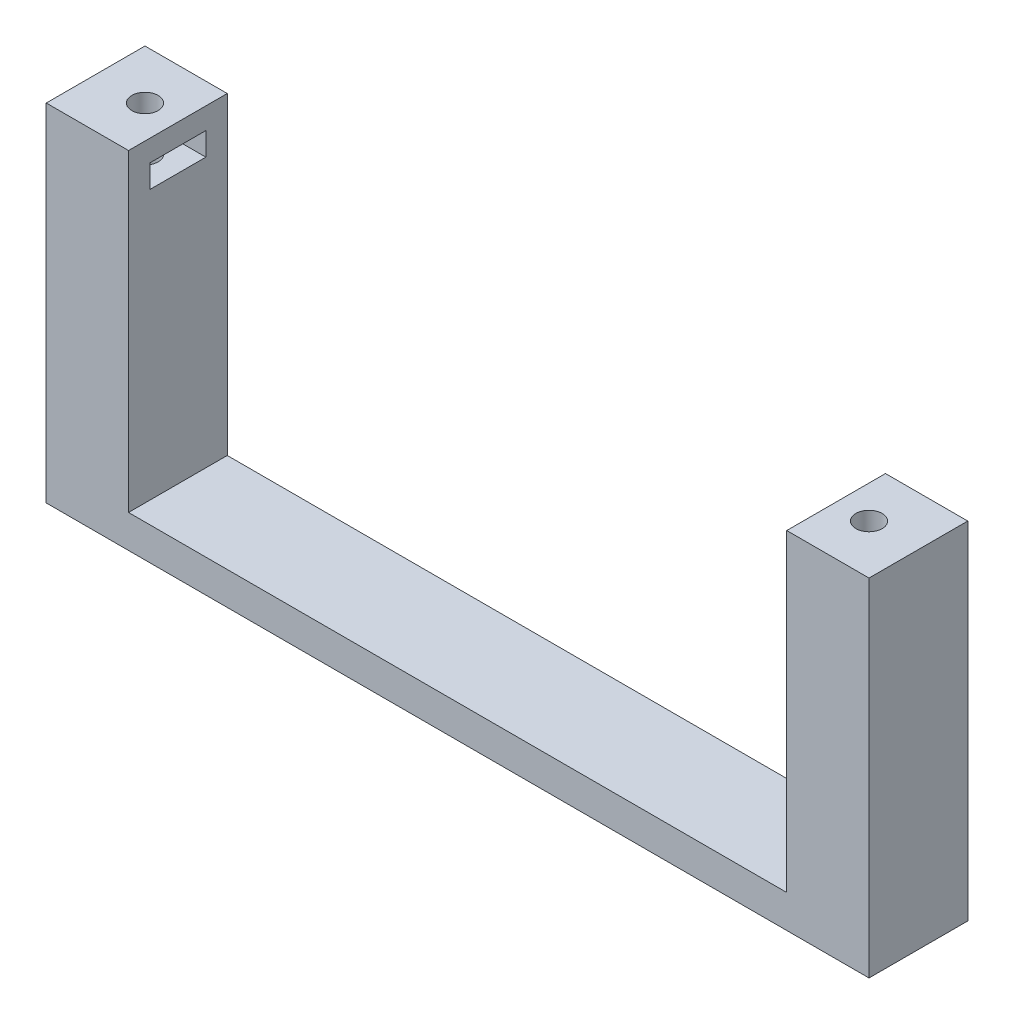
ISO-10303-21;
HEADER;
FILE_DESCRIPTION(('STEP AP214'),'2;1');
FILE_NAME('part.step','',(''),(''),'','','');
FILE_SCHEMA(('AUTOMOTIVE_DESIGN { 1 0 10303 214 1 1 1 1 }'));
ENDSEC;
DATA;
#1=APPLICATION_CONTEXT('core data for automotive mechanical design processes');
#2=APPLICATION_PROTOCOL_DEFINITION('international standard','automotive_design',2000,#1);
#3=PRODUCT_CONTEXT('',#1,'mechanical');
#4=PRODUCT('Part','Part','',(#3));
#5=PRODUCT_RELATED_PRODUCT_CATEGORY('part','',(#4));
#6=PRODUCT_DEFINITION_FORMATION('','',#4);
#7=PRODUCT_DEFINITION_CONTEXT('part definition',#1,'design');
#8=PRODUCT_DEFINITION('design','',#6,#7);
#9=PRODUCT_DEFINITION_SHAPE('','',#8);
#10=(LENGTH_UNIT() NAMED_UNIT(*) SI_UNIT(.MILLI.,.METRE.));
#11=(NAMED_UNIT(*) PLANE_ANGLE_UNIT() SI_UNIT($,.RADIAN.));
#12=(NAMED_UNIT(*) SI_UNIT($,.STERADIAN.) SOLID_ANGLE_UNIT());
#13=UNCERTAINTY_MEASURE_WITH_UNIT(LENGTH_MEASURE(1.E-05),#10,'distance_accuracy_value','');
#14=(GEOMETRIC_REPRESENTATION_CONTEXT(3) GLOBAL_UNCERTAINTY_ASSIGNED_CONTEXT((#13)) GLOBAL_UNIT_ASSIGNED_CONTEXT((#10,
#11,#12)) REPRESENTATION_CONTEXT('',''));
#15=CARTESIAN_POINT('',(0.,0.,0.));
#16=DIRECTION('',(0.,0.,1.));
#17=DIRECTION('',(1.,0.,0.));
#18=AXIS2_PLACEMENT_3D('',#15,#16,#17);
#19=CARTESIAN_POINT('',(-44.,4.,0.));
#20=DIRECTION('',(0.,-1.,0.));
#21=DIRECTION('',(0.,0.,-1.));
#22=AXIS2_PLACEMENT_3D('',#19,#20,#21);
#23=CYLINDRICAL_SURFACE('',#22,1.6);
#24=CARTESIAN_POINT('',(-44.,42.1,0.));
#25=DIRECTION('',(0.,1.,0.));
#26=DIRECTION('',(0.,0.,1.));
#27=AXIS2_PLACEMENT_3D('',#24,#25,#26);
#28=CIRCLE('',#27,1.6);
#29=CARTESIAN_POINT('',(-44.,42.1,1.6));
#30=VERTEX_POINT('',#29);
#31=EDGE_CURVE('E316',#30,#30,#28,.T.);
#32=ORIENTED_EDGE('',*,*,#31,.T.);
#33=EDGE_LOOP('',(#32));
#34=FACE_BOUND('',#33,.T.);
#35=CARTESIAN_POINT('',(-44.,39.5,0.));
#36=DIRECTION('',(0.,-1.,0.));
#37=DIRECTION('',(0.,0.,-1.));
#38=AXIS2_PLACEMENT_3D('',#35,#36,#37);
#39=CIRCLE('',#38,1.6);
#40=CARTESIAN_POINT('',(-44.,39.5,-1.6));
#41=VERTEX_POINT('',#40);
#42=EDGE_CURVE('E227',#41,#41,#39,.T.);
#43=ORIENTED_EDGE('',*,*,#42,.T.);
#44=EDGE_LOOP('',(#43));
#45=FACE_BOUND('',#44,.T.);
#46=ADVANCED_FACE('F68',(#34,#45),#23,.F.);
#47=CARTESIAN_POINT('',(-40.,42.1,-6.));
#48=DIRECTION('',(-1.,0.,0.));
#49=DIRECTION('',(0.,0.,1.));
#50=AXIS2_PLACEMENT_3D('',#47,#48,#49);
#51=PLANE('',#50);
#52=DIRECTION('',(0.,0.,-1.));
#53=VECTOR('',#52,1.);
#54=CARTESIAN_POINT('',(-40.,4.,-6.));
#55=LINE('',#54,#53);
#56=CARTESIAN_POINT('',(-40.,4.,6.));
#57=VERTEX_POINT('',#56);
#58=CARTESIAN_POINT('',(-40.,4.,-6.));
#59=VERTEX_POINT('',#58);
#60=EDGE_CURVE('E320',#57,#59,#55,.T.);
#61=ORIENTED_EDGE('',*,*,#60,.T.);
#62=DIRECTION('',(0.,-1.,0.));
#63=VECTOR('',#62,1.);
#64=CARTESIAN_POINT('',(-40.,42.1,-6.));
#65=LINE('',#64,#63);
#66=CARTESIAN_POINT('',(-40.,42.1,-6.));
#67=VERTEX_POINT('',#66);
#68=EDGE_CURVE('E335',#67,#59,#65,.T.);
#69=ORIENTED_EDGE('',*,*,#68,.F.);
#70=DIRECTION('',(0.,0.,-1.));
#71=VECTOR('',#70,1.);
#72=CARTESIAN_POINT('',(-40.,42.1,-6.));
#73=LINE('',#72,#71);
#74=CARTESIAN_POINT('',(-40.,42.1,6.));
#75=VERTEX_POINT('',#74);
#76=EDGE_CURVE('E328',#75,#67,#73,.T.);
#77=ORIENTED_EDGE('',*,*,#76,.F.);
#78=DIRECTION('',(0.,-1.,0.));
#79=VECTOR('',#78,1.);
#80=CARTESIAN_POINT('',(-40.,42.1,6.));
#81=LINE('',#80,#79);
#82=EDGE_CURVE('E342',#75,#57,#81,.T.);
#83=ORIENTED_EDGE('',*,*,#82,.T.);
#84=EDGE_LOOP('',(#61,#69,#77,#83));
#85=FACE_BOUND('',#84,.T.);
#86=DIRECTION('',(0.,-1.,0.));
#87=VECTOR('',#86,1.);
#88=CARTESIAN_POINT('',(-40.,0.,-3.40000000000002));
#89=LINE('',#88,#87);
#90=CARTESIAN_POINT('',(-40.,39.5,-3.40000000000003));
#91=VERTEX_POINT('',#90);
#92=CARTESIAN_POINT('',(-40.,36.7,-3.40000000000002));
#93=VERTEX_POINT('',#92);
#94=EDGE_CURVE('E84',#91,#93,#89,.T.);
#95=ORIENTED_EDGE('',*,*,#94,.T.);
#96=DIRECTION('',(0.,0.,-1.));
#97=VECTOR('',#96,1.);
#98=CARTESIAN_POINT('',(-40.,36.7,0.));
#99=LINE('',#98,#97);
#100=CARTESIAN_POINT('',(-40.,36.7,3.39999999999998));
#101=VERTEX_POINT('',#100);
#102=EDGE_CURVE('E205',#101,#93,#99,.T.);
#103=ORIENTED_EDGE('',*,*,#102,.F.);
#104=DIRECTION('',(0.,-1.,0.));
#105=VECTOR('',#104,1.);
#106=CARTESIAN_POINT('',(-40.,0.,3.39999999999997));
#107=LINE('',#106,#105);
#108=CARTESIAN_POINT('',(-40.,39.5,3.39999999999998));
#109=VERTEX_POINT('',#108);
#110=EDGE_CURVE('E209',#109,#101,#107,.T.);
#111=ORIENTED_EDGE('',*,*,#110,.F.);
#112=DIRECTION('',(0.,0.,-1.));
#113=VECTOR('',#112,1.);
#114=CARTESIAN_POINT('',(-40.,39.5,0.));
#115=LINE('',#114,#113);
#116=EDGE_CURVE('E218',#109,#91,#115,.T.);
#117=ORIENTED_EDGE('',*,*,#116,.T.);
#118=EDGE_LOOP('',(#95,#103,#111,#117));
#119=FACE_BOUND('',#118,.T.);
#120=ADVANCED_FACE('F412',(#85,#119),#51,.F.);
#121=CARTESIAN_POINT('',(44.,4.,0.));
#122=DIRECTION('',(0.,-1.,0.));
#123=DIRECTION('',(0.,0.,-1.));
#124=AXIS2_PLACEMENT_3D('',#121,#122,#123);
#125=CYLINDRICAL_SURFACE('',#124,1.6);
#126=CARTESIAN_POINT('',(44.,42.1,0.));
#127=DIRECTION('',(0.,1.,0.));
#128=DIRECTION('',(0.,0.,1.));
#129=AXIS2_PLACEMENT_3D('',#126,#127,#128);
#130=CIRCLE('',#129,1.6);
#131=CARTESIAN_POINT('',(44.,42.1,1.59999999999997));
#132=VERTEX_POINT('',#131);
#133=EDGE_CURVE('E288',#132,#132,#130,.T.);
#134=ORIENTED_EDGE('',*,*,#133,.T.);
#135=EDGE_LOOP('',(#134));
#136=FACE_BOUND('',#135,.T.);
#137=CARTESIAN_POINT('',(44.,39.5,0.));
#138=DIRECTION('',(0.,-1.,0.));
#139=DIRECTION('',(0.,0.,-1.));
#140=AXIS2_PLACEMENT_3D('',#137,#138,#139);
#141=CIRCLE('',#140,1.6);
#142=CARTESIAN_POINT('',(44.,39.5,-1.60000000000002));
#143=VERTEX_POINT('',#142);
#144=EDGE_CURVE('E272',#143,#143,#141,.T.);
#145=ORIENTED_EDGE('',*,*,#144,.T.);
#146=EDGE_LOOP('',(#145));
#147=FACE_BOUND('',#146,.T.);
#148=ADVANCED_FACE('F431',(#136,#147),#125,.F.);
#149=CARTESIAN_POINT('',(40.,42.1,-6.));
#150=DIRECTION('',(1.,0.,0.));
#151=DIRECTION('',(0.,0.,-1.));
#152=AXIS2_PLACEMENT_3D('',#149,#150,#151);
#153=PLANE('',#152);
#154=DIRECTION('',(0.,0.,1.));
#155=VECTOR('',#154,1.);
#156=CARTESIAN_POINT('',(40.,4.,-6.));
#157=LINE('',#156,#155);
#158=CARTESIAN_POINT('',(40.,4.,-6.));
#159=VERTEX_POINT('',#158);
#160=CARTESIAN_POINT('',(40.,4.,6.));
#161=VERTEX_POINT('',#160);
#162=EDGE_CURVE('E292',#159,#161,#157,.T.);
#163=ORIENTED_EDGE('',*,*,#162,.T.);
#164=DIRECTION('',(0.,-1.,0.));
#165=VECTOR('',#164,1.);
#166=CARTESIAN_POINT('',(40.,42.1,6.));
#167=LINE('',#166,#165);
#168=CARTESIAN_POINT('',(40.,42.1,6.));
#169=VERTEX_POINT('',#168);
#170=EDGE_CURVE('E307',#169,#161,#167,.T.);
#171=ORIENTED_EDGE('',*,*,#170,.F.);
#172=DIRECTION('',(0.,0.,1.));
#173=VECTOR('',#172,1.);
#174=CARTESIAN_POINT('',(40.,42.1,-6.));
#175=LINE('',#174,#173);
#176=CARTESIAN_POINT('',(40.,42.1,-6.));
#177=VERTEX_POINT('',#176);
#178=EDGE_CURVE('E300',#177,#169,#175,.T.);
#179=ORIENTED_EDGE('',*,*,#178,.F.);
#180=DIRECTION('',(0.,-1.,0.));
#181=VECTOR('',#180,1.);
#182=CARTESIAN_POINT('',(40.,42.1,-6.));
#183=LINE('',#182,#181);
#184=EDGE_CURVE('E313',#177,#159,#183,.T.);
#185=ORIENTED_EDGE('',*,*,#184,.T.);
#186=EDGE_LOOP('',(#163,#171,#179,#185));
#187=FACE_BOUND('',#186,.T.);
#188=DIRECTION('',(0.,-1.,0.));
#189=VECTOR('',#188,1.);
#190=CARTESIAN_POINT('',(40.,0.,3.40000000000002));
#191=LINE('',#190,#189);
#192=CARTESIAN_POINT('',(40.,39.5,3.40000000000003));
#193=VERTEX_POINT('',#192);
#194=CARTESIAN_POINT('',(40.,36.7,3.40000000000002));
#195=VERTEX_POINT('',#194);
#196=EDGE_CURVE('E92',#193,#195,#191,.T.);
#197=ORIENTED_EDGE('',*,*,#196,.T.);
#198=DIRECTION('',(0.,0.,1.));
#199=VECTOR('',#198,1.);
#200=CARTESIAN_POINT('',(40.,36.7,0.));
#201=LINE('',#200,#199);
#202=CARTESIAN_POINT('',(40.,36.7,-3.39999999999998));
#203=VERTEX_POINT('',#202);
#204=EDGE_CURVE('E244',#203,#195,#201,.T.);
#205=ORIENTED_EDGE('',*,*,#204,.F.);
#206=DIRECTION('',(0.,-1.,0.));
#207=VECTOR('',#206,1.);
#208=CARTESIAN_POINT('',(40.,0.,-3.39999999999997));
#209=LINE('',#208,#207);
#210=CARTESIAN_POINT('',(40.,39.5,-3.39999999999998));
#211=VERTEX_POINT('',#210);
#212=EDGE_CURVE('E262',#211,#203,#209,.T.);
#213=ORIENTED_EDGE('',*,*,#212,.F.);
#214=DIRECTION('',(0.,0.,1.));
#215=VECTOR('',#214,1.);
#216=CARTESIAN_POINT('',(40.,39.5,0.));
#217=LINE('',#216,#215);
#218=EDGE_CURVE('E258',#211,#193,#217,.T.);
#219=ORIENTED_EDGE('',*,*,#218,.T.);
#220=EDGE_LOOP('',(#197,#205,#213,#219));
#221=FACE_BOUND('',#220,.T.);
#222=ADVANCED_FACE('F421',(#187,#221),#153,.F.);
#223=CARTESIAN_POINT('',(0.,4.,0.));
#224=DIRECTION('',(0.,-1.,0.));
#225=DIRECTION('',(0.,0.,-1.));
#226=AXIS2_PLACEMENT_3D('',#223,#224,#225);
#227=PLANE('',#226);
#228=ORIENTED_EDGE('',*,*,#162,.F.);
#229=DIRECTION('',(1.,0.,0.));
#230=VECTOR('',#229,1.);
#231=CARTESIAN_POINT('',(-50.,4.,-6.));
#232=LINE('',#231,#230);
#233=EDGE_CURVE('E359',#59,#159,#232,.T.);
#234=ORIENTED_EDGE('',*,*,#233,.F.);
#235=ORIENTED_EDGE('',*,*,#60,.F.);
#236=DIRECTION('',(1.,0.,0.));
#237=VECTOR('',#236,1.);
#238=CARTESIAN_POINT('',(-50.,4.,6.));
#239=LINE('',#238,#237);
#240=EDGE_CURVE('E355',#57,#161,#239,.T.);
#241=ORIENTED_EDGE('',*,*,#240,.T.);
#242=EDGE_LOOP('',(#228,#234,#235,#241));
#243=FACE_BOUND('',#242,.T.);
#244=ADVANCED_FACE('F416',(#243),#227,.F.);
#245=CARTESIAN_POINT('',(0.,0.,0.));
#246=DIRECTION('',(0.,-1.,0.));
#247=DIRECTION('',(0.,0.,-1.));
#248=AXIS2_PLACEMENT_3D('',#245,#246,#247);
#249=PLANE('',#248);
#250=CARTESIAN_POINT('',(-44.,0.,0.));
#251=DIRECTION('',(0.,1.,0.));
#252=DIRECTION('',(0.,0.,1.));
#253=AXIS2_PLACEMENT_3D('',#250,#251,#252);
#254=CIRCLE('',#253,1.6);
#255=CARTESIAN_POINT('',(-44.,0.,1.6));
#256=VERTEX_POINT('',#255);
#257=EDGE_CURVE('E350',#256,#256,#254,.T.);
#258=ORIENTED_EDGE('',*,*,#257,.T.);
#259=EDGE_LOOP('',(#258));
#260=FACE_BOUND('',#259,.T.);
#261=DIRECTION('',(1.,0.,0.));
#262=VECTOR('',#261,1.);
#263=CARTESIAN_POINT('',(-50.,0.,6.));
#264=LINE('',#263,#262);
#265=CARTESIAN_POINT('',(-50.,0.,6.));
#266=VERTEX_POINT('',#265);
#267=CARTESIAN_POINT('',(50.,0.,6.));
#268=VERTEX_POINT('',#267);
#269=EDGE_CURVE('E354',#266,#268,#264,.T.);
#270=ORIENTED_EDGE('',*,*,#269,.F.);
#271=DIRECTION('',(0.,0.,1.));
#272=VECTOR('',#271,1.);
#273=CARTESIAN_POINT('',(-50.,0.,-6.));
#274=LINE('',#273,#272);
#275=CARTESIAN_POINT('',(-50.,0.,-6.));
#276=VERTEX_POINT('',#275);
#277=EDGE_CURVE('E360',#276,#266,#274,.T.);
#278=ORIENTED_EDGE('',*,*,#277,.F.);
#279=DIRECTION('',(1.,0.,0.));
#280=VECTOR('',#279,1.);
#281=CARTESIAN_POINT('',(-50.,0.,-6.));
#282=LINE('',#281,#280);
#283=CARTESIAN_POINT('',(50.,0.,-6.));
#284=VERTEX_POINT('',#283);
#285=EDGE_CURVE('E372',#276,#284,#282,.T.);
#286=ORIENTED_EDGE('',*,*,#285,.T.);
#287=DIRECTION('',(0.,0.,1.));
#288=VECTOR('',#287,1.);
#289=CARTESIAN_POINT('',(50.,0.,-6.));
#290=LINE('',#289,#288);
#291=EDGE_CURVE('E368',#284,#268,#290,.T.);
#292=ORIENTED_EDGE('',*,*,#291,.T.);
#293=EDGE_LOOP('',(#270,#278,#286,#292));
#294=FACE_BOUND('',#293,.T.);
#295=CARTESIAN_POINT('',(44.,0.,0.));
#296=DIRECTION('',(0.,1.,0.));
#297=DIRECTION('',(0.,0.,1.));
#298=AXIS2_PLACEMENT_3D('',#295,#296,#297);
#299=CIRCLE('',#298,1.6);
#300=CARTESIAN_POINT('',(44.,0.,1.59999999999997));
#301=VERTEX_POINT('',#300);
#302=EDGE_CURVE('E346',#301,#301,#299,.T.);
#303=ORIENTED_EDGE('',*,*,#302,.T.);
#304=EDGE_LOOP('',(#303));
#305=FACE_BOUND('',#304,.T.);
#306=ADVANCED_FACE('F396',(#260,#294,#305),#249,.T.);
#307=CARTESIAN_POINT('',(-50.,4.,6.));
#308=DIRECTION('',(0.,0.,-1.));
#309=DIRECTION('',(-1.,0.,0.));
#310=AXIS2_PLACEMENT_3D('',#307,#308,#309);
#311=PLANE('',#310);
#312=ORIENTED_EDGE('',*,*,#269,.T.);
#313=DIRECTION('',(0.,-1.,0.));
#314=VECTOR('',#313,1.);
#315=CARTESIAN_POINT('',(50.,4.,6.));
#316=LINE('',#315,#314);
#317=CARTESIAN_POINT('',(50.,42.1,6.));
#318=VERTEX_POINT('',#317);
#319=EDGE_CURVE('E12',#318,#268,#316,.T.);
#320=ORIENTED_EDGE('',*,*,#319,.F.);
#321=DIRECTION('',(1.,0.,0.));
#322=VECTOR('',#321,1.);
#323=CARTESIAN_POINT('',(50.,42.1,6.));
#324=LINE('',#323,#322);
#325=EDGE_CURVE('E303',#169,#318,#324,.T.);
#326=ORIENTED_EDGE('',*,*,#325,.F.);
#327=ORIENTED_EDGE('',*,*,#170,.T.);
#328=ORIENTED_EDGE('',*,*,#240,.F.);
#329=ORIENTED_EDGE('',*,*,#82,.F.);
#330=DIRECTION('',(1.,0.,0.));
#331=VECTOR('',#330,1.);
#332=CARTESIAN_POINT('',(-50.,42.1,6.));
#333=LINE('',#332,#331);
#334=CARTESIAN_POINT('',(-50.,42.1,6.));
#335=VERTEX_POINT('',#334);
#336=EDGE_CURVE('E325',#335,#75,#333,.T.);
#337=ORIENTED_EDGE('',*,*,#336,.F.);
#338=DIRECTION('',(0.,-1.,0.));
#339=VECTOR('',#338,1.);
#340=CARTESIAN_POINT('',(-50.,4.,6.));
#341=LINE('',#340,#339);
#342=EDGE_CURVE('E364',#335,#266,#341,.T.);
#343=ORIENTED_EDGE('',*,*,#342,.T.);
#344=EDGE_LOOP('',(#312,#320,#326,#327,#328,#329,#337,#343));
#345=FACE_BOUND('',#344,.T.);
#346=ADVANCED_FACE('F70',(#345),#311,.F.);
#347=CARTESIAN_POINT('',(50.,4.,-6.));
#348=DIRECTION('',(1.,0.,0.));
#349=DIRECTION('',(0.,0.,-1.));
#350=AXIS2_PLACEMENT_3D('',#347,#348,#349);
#351=PLANE('',#350);
#352=ORIENTED_EDGE('',*,*,#291,.F.);
#353=DIRECTION('',(0.,-1.,0.));
#354=VECTOR('',#353,1.);
#355=CARTESIAN_POINT('',(50.,4.,-6.));
#356=LINE('',#355,#354);
#357=CARTESIAN_POINT('',(50.,42.1,-6.));
#358=VERTEX_POINT('',#357);
#359=EDGE_CURVE('E77',#358,#284,#356,.T.);
#360=ORIENTED_EDGE('',*,*,#359,.F.);
#361=DIRECTION('',(0.,0.,-1.));
#362=VECTOR('',#361,1.);
#363=CARTESIAN_POINT('',(50.,42.1,-6.));
#364=LINE('',#363,#362);
#365=EDGE_CURVE('E293',#318,#358,#364,.T.);
#366=ORIENTED_EDGE('',*,*,#365,.F.);
#367=ORIENTED_EDGE('',*,*,#319,.T.);
#368=EDGE_LOOP('',(#352,#360,#366,#367));
#369=FACE_BOUND('',#368,.T.);
#370=ADVANCED_FACE('F392',(#369),#351,.T.);
#371=CARTESIAN_POINT('',(-50.,4.,-6.));
#372=DIRECTION('',(0.,0.,-1.));
#373=DIRECTION('',(-1.,0.,0.));
#374=AXIS2_PLACEMENT_3D('',#371,#372,#373);
#375=PLANE('',#374);
#376=ORIENTED_EDGE('',*,*,#285,.F.);
#377=DIRECTION('',(0.,-1.,0.));
#378=VECTOR('',#377,1.);
#379=CARTESIAN_POINT('',(-50.,4.,-6.));
#380=LINE('',#379,#378);
#381=CARTESIAN_POINT('',(-50.,42.1,-6.));
#382=VERTEX_POINT('',#381);
#383=EDGE_CURVE('E381',#382,#276,#380,.T.);
#384=ORIENTED_EDGE('',*,*,#383,.F.);
#385=DIRECTION('',(-1.,0.,0.));
#386=VECTOR('',#385,1.);
#387=CARTESIAN_POINT('',(-50.,42.1,-6.));
#388=LINE('',#387,#386);
#389=EDGE_CURVE('E331',#67,#382,#388,.T.);
#390=ORIENTED_EDGE('',*,*,#389,.F.);
#391=ORIENTED_EDGE('',*,*,#68,.T.);
#392=ORIENTED_EDGE('',*,*,#233,.T.);
#393=ORIENTED_EDGE('',*,*,#184,.F.);
#394=DIRECTION('',(-1.,0.,0.));
#395=VECTOR('',#394,1.);
#396=CARTESIAN_POINT('',(50.,42.1,-6.));
#397=LINE('',#396,#395);
#398=EDGE_CURVE('E297',#358,#177,#397,.T.);
#399=ORIENTED_EDGE('',*,*,#398,.F.);
#400=ORIENTED_EDGE('',*,*,#359,.T.);
#401=EDGE_LOOP('',(#376,#384,#390,#391,#392,#393,#399,#400));
#402=FACE_BOUND('',#401,.T.);
#403=ADVANCED_FACE('F388',(#402),#375,.T.);
#404=CARTESIAN_POINT('',(-50.,4.,-6.));
#405=DIRECTION('',(1.,0.,0.));
#406=DIRECTION('',(0.,0.,-1.));
#407=AXIS2_PLACEMENT_3D('',#404,#405,#406);
#408=PLANE('',#407);
#409=ORIENTED_EDGE('',*,*,#277,.T.);
#410=ORIENTED_EDGE('',*,*,#342,.F.);
#411=DIRECTION('',(0.,0.,1.));
#412=VECTOR('',#411,1.);
#413=CARTESIAN_POINT('',(-50.,42.1,-6.));
#414=LINE('',#413,#412);
#415=EDGE_CURVE('E321',#382,#335,#414,.T.);
#416=ORIENTED_EDGE('',*,*,#415,.F.);
#417=ORIENTED_EDGE('',*,*,#383,.T.);
#418=EDGE_LOOP('',(#409,#410,#416,#417));
#419=FACE_BOUND('',#418,.T.);
#420=ADVANCED_FACE('F399',(#419),#408,.F.);
#421=CARTESIAN_POINT('',(-44.,36.7,0.));
#422=DIRECTION('',(0.,-1.,0.));
#423=DIRECTION('',(0.,0.,-1.));
#424=AXIS2_PLACEMENT_3D('',#421,#422,#423);
#425=CIRCLE('',#424,1.6);
#426=CARTESIAN_POINT('',(-44.,36.7,-1.6));
#427=VERTEX_POINT('',#426);
#428=EDGE_CURVE('E236',#427,#427,#425,.T.);
#429=ORIENTED_EDGE('',*,*,#428,.F.);
#430=EDGE_LOOP('',(#429));
#431=FACE_BOUND('',#430,.T.);
#432=ORIENTED_EDGE('',*,*,#257,.F.);
#433=EDGE_LOOP('',(#432));
#434=FACE_BOUND('',#433,.T.);
#435=ADVANCED_FACE('F467',(#431,#434),#23,.F.);
#436=CARTESIAN_POINT('',(44.,36.7,0.));
#437=DIRECTION('',(0.,-1.,0.));
#438=DIRECTION('',(0.,0.,-1.));
#439=AXIS2_PLACEMENT_3D('',#436,#437,#438);
#440=CIRCLE('',#439,1.6);
#441=CARTESIAN_POINT('',(44.,36.7,-1.60000000000002));
#442=VERTEX_POINT('',#441);
#443=EDGE_CURVE('E284',#442,#442,#440,.T.);
#444=ORIENTED_EDGE('',*,*,#443,.F.);
#445=EDGE_LOOP('',(#444));
#446=FACE_BOUND('',#445,.T.);
#447=ORIENTED_EDGE('',*,*,#302,.F.);
#448=EDGE_LOOP('',(#447));
#449=FACE_BOUND('',#448,.T.);
#450=ADVANCED_FACE('F435',(#446,#449),#125,.F.);
#451=CARTESIAN_POINT('',(0.,42.1,0.));
#452=DIRECTION('',(0.,1.,0.));
#453=DIRECTION('',(0.,0.,1.));
#454=AXIS2_PLACEMENT_3D('',#451,#452,#453);
#455=PLANE('',#454);
#456=ORIENTED_EDGE('',*,*,#415,.T.);
#457=ORIENTED_EDGE('',*,*,#336,.T.);
#458=ORIENTED_EDGE('',*,*,#76,.T.);
#459=ORIENTED_EDGE('',*,*,#389,.T.);
#460=EDGE_LOOP('',(#456,#457,#458,#459));
#461=FACE_BOUND('',#460,.T.);
#462=ORIENTED_EDGE('',*,*,#31,.F.);
#463=EDGE_LOOP('',(#462));
#464=FACE_BOUND('',#463,.T.);
#465=ADVANCED_FACE('F407',(#461,#464),#455,.T.);
#466=CARTESIAN_POINT('',(0.,42.1,0.));
#467=DIRECTION('',(0.,-1.,0.));
#468=DIRECTION('',(0.,0.,-1.));
#469=AXIS2_PLACEMENT_3D('',#466,#467,#468);
#470=PLANE('',#469);
#471=ORIENTED_EDGE('',*,*,#365,.T.);
#472=ORIENTED_EDGE('',*,*,#398,.T.);
#473=ORIENTED_EDGE('',*,*,#178,.T.);
#474=ORIENTED_EDGE('',*,*,#325,.T.);
#475=EDGE_LOOP('',(#471,#472,#473,#474));
#476=FACE_BOUND('',#475,.T.);
#477=ORIENTED_EDGE('',*,*,#133,.F.);
#478=EDGE_LOOP('',(#477));
#479=FACE_BOUND('',#478,.T.);
#480=ADVANCED_FACE('F424',(#476,#479),#470,.F.);
#481=CARTESIAN_POINT('',(48.5,0.,3.40000000000003));
#482=DIRECTION('',(0.,0.,-1.));
#483=DIRECTION('',(-1.,0.,0.));
#484=AXIS2_PLACEMENT_3D('',#481,#482,#483);
#485=PLANE('',#484);
#486=ORIENTED_EDGE('',*,*,#196,.F.);
#487=DIRECTION('',(-1.,0.,0.));
#488=VECTOR('',#487,1.);
#489=CARTESIAN_POINT('',(48.5,39.5,3.40000000000003));
#490=LINE('',#489,#488);
#491=CARTESIAN_POINT('',(48.5,39.5,3.40000000000003));
#492=VERTEX_POINT('',#491);
#493=EDGE_CURVE('E255',#492,#193,#490,.T.);
#494=ORIENTED_EDGE('',*,*,#493,.F.);
#495=DIRECTION('',(0.,-1.,0.));
#496=VECTOR('',#495,1.);
#497=CARTESIAN_POINT('',(48.5,0.,3.40000000000003));
#498=LINE('',#497,#496);
#499=CARTESIAN_POINT('',(48.5,36.7,3.40000000000003));
#500=VERTEX_POINT('',#499);
#501=EDGE_CURVE('E240',#492,#500,#498,.T.);
#502=ORIENTED_EDGE('',*,*,#501,.T.);
#503=DIRECTION('',(-1.,0.,0.));
#504=VECTOR('',#503,1.);
#505=CARTESIAN_POINT('',(48.5,36.7,3.40000000000003));
#506=LINE('',#505,#504);
#507=EDGE_CURVE('E269',#500,#195,#506,.T.);
#508=ORIENTED_EDGE('',*,*,#507,.T.);
#509=EDGE_LOOP('',(#486,#494,#502,#508));
#510=FACE_BOUND('',#509,.T.);
#511=ADVANCED_FACE('F427',(#510),#485,.T.);
#512=CARTESIAN_POINT('',(48.5,36.7,0.));
#513=DIRECTION('',(0.,-1.,0.));
#514=DIRECTION('',(0.,0.,-1.));
#515=AXIS2_PLACEMENT_3D('',#512,#513,#514);
#516=PLANE('',#515);
#517=ORIENTED_EDGE('',*,*,#443,.T.);
#518=EDGE_LOOP('',(#517));
#519=FACE_BOUND('',#518,.T.);
#520=ORIENTED_EDGE('',*,*,#204,.T.);
#521=ORIENTED_EDGE('',*,*,#507,.F.);
#522=DIRECTION('',(0.,0.,1.));
#523=VECTOR('',#522,1.);
#524=CARTESIAN_POINT('',(48.5,36.7,0.));
#525=LINE('',#524,#523);
#526=CARTESIAN_POINT('',(48.5,36.7,-3.39999999999997));
#527=VERTEX_POINT('',#526);
#528=EDGE_CURVE('E251',#527,#500,#525,.T.);
#529=ORIENTED_EDGE('',*,*,#528,.F.);
#530=DIRECTION('',(-1.,0.,0.));
#531=VECTOR('',#530,1.);
#532=CARTESIAN_POINT('',(48.5,36.7,-3.39999999999997));
#533=LINE('',#532,#531);
#534=EDGE_CURVE('E273',#527,#203,#533,.T.);
#535=ORIENTED_EDGE('',*,*,#534,.T.);
#536=EDGE_LOOP('',(#520,#521,#529,#535));
#537=FACE_BOUND('',#536,.T.);
#538=ADVANCED_FACE('F455',(#519,#537),#516,.F.);
#539=CARTESIAN_POINT('',(48.5,0.,-3.39999999999997));
#540=DIRECTION('',(0.,0.,-1.));
#541=DIRECTION('',(-1.,0.,0.));
#542=AXIS2_PLACEMENT_3D('',#539,#540,#541);
#543=PLANE('',#542);
#544=ORIENTED_EDGE('',*,*,#212,.T.);
#545=ORIENTED_EDGE('',*,*,#534,.F.);
#546=DIRECTION('',(0.,-1.,0.));
#547=VECTOR('',#546,1.);
#548=CARTESIAN_POINT('',(48.5,0.,-3.39999999999997));
#549=LINE('',#548,#547);
#550=CARTESIAN_POINT('',(48.5,39.5,-3.39999999999997));
#551=VERTEX_POINT('',#550);
#552=EDGE_CURVE('E247',#551,#527,#549,.T.);
#553=ORIENTED_EDGE('',*,*,#552,.F.);
#554=DIRECTION('',(-1.,0.,0.));
#555=VECTOR('',#554,1.);
#556=CARTESIAN_POINT('',(48.5,39.5,-3.39999999999997));
#557=LINE('',#556,#555);
#558=EDGE_CURVE('E276',#551,#211,#557,.T.);
#559=ORIENTED_EDGE('',*,*,#558,.T.);
#560=EDGE_LOOP('',(#544,#545,#553,#559));
#561=FACE_BOUND('',#560,.T.);
#562=ADVANCED_FACE('F442',(#561),#543,.F.);
#563=CARTESIAN_POINT('',(48.5,39.5,0.));
#564=DIRECTION('',(0.,-1.,0.));
#565=DIRECTION('',(0.,0.,-1.));
#566=AXIS2_PLACEMENT_3D('',#563,#564,#565);
#567=PLANE('',#566);
#568=ORIENTED_EDGE('',*,*,#144,.F.);
#569=EDGE_LOOP('',(#568));
#570=FACE_BOUND('',#569,.T.);
#571=ORIENTED_EDGE('',*,*,#218,.F.);
#572=ORIENTED_EDGE('',*,*,#558,.F.);
#573=DIRECTION('',(0.,0.,1.));
#574=VECTOR('',#573,1.);
#575=CARTESIAN_POINT('',(48.5,39.5,0.));
#576=LINE('',#575,#574);
#577=EDGE_CURVE('E243',#551,#492,#576,.T.);
#578=ORIENTED_EDGE('',*,*,#577,.T.);
#579=ORIENTED_EDGE('',*,*,#493,.T.);
#580=EDGE_LOOP('',(#571,#572,#578,#579));
#581=FACE_BOUND('',#580,.T.);
#582=ADVANCED_FACE('F438',(#570,#581),#567,.T.);
#583=CARTESIAN_POINT('',(48.5,0.,0.));
#584=DIRECTION('',(-1.,0.,0.));
#585=DIRECTION('',(0.,0.,1.));
#586=AXIS2_PLACEMENT_3D('',#583,#584,#585);
#587=PLANE('',#586);
#588=ORIENTED_EDGE('',*,*,#501,.F.);
#589=ORIENTED_EDGE('',*,*,#577,.F.);
#590=ORIENTED_EDGE('',*,*,#552,.T.);
#591=ORIENTED_EDGE('',*,*,#528,.T.);
#592=EDGE_LOOP('',(#588,#589,#590,#591));
#593=FACE_BOUND('',#592,.T.);
#594=ADVANCED_FACE('F441',(#593),#587,.T.);
#595=CARTESIAN_POINT('',(-48.5,0.,-3.40000000000003));
#596=DIRECTION('',(0.,0.,1.));
#597=DIRECTION('',(1.,0.,0.));
#598=AXIS2_PLACEMENT_3D('',#595,#596,#597);
#599=PLANE('',#598);
#600=ORIENTED_EDGE('',*,*,#94,.F.);
#601=DIRECTION('',(1.,0.,0.));
#602=VECTOR('',#601,1.);
#603=CARTESIAN_POINT('',(-48.5,39.5,-3.40000000000003));
#604=LINE('',#603,#602);
#605=CARTESIAN_POINT('',(-48.5,39.5,-3.40000000000003));
#606=VERTEX_POINT('',#605);
#607=EDGE_CURVE('E185',#606,#91,#604,.T.);
#608=ORIENTED_EDGE('',*,*,#607,.F.);
#609=DIRECTION('',(0.,-1.,0.));
#610=VECTOR('',#609,1.);
#611=CARTESIAN_POINT('',(-48.5,0.,-3.40000000000003));
#612=LINE('',#611,#610);
#613=CARTESIAN_POINT('',(-48.5,36.7,-3.40000000000003));
#614=VERTEX_POINT('',#613);
#615=EDGE_CURVE('E194',#606,#614,#612,.T.);
#616=ORIENTED_EDGE('',*,*,#615,.T.);
#617=DIRECTION('',(1.,0.,0.));
#618=VECTOR('',#617,1.);
#619=CARTESIAN_POINT('',(-48.5,36.7,-3.40000000000003));
#620=LINE('',#619,#618);
#621=EDGE_CURVE('E224',#614,#93,#620,.T.);
#622=ORIENTED_EDGE('',*,*,#621,.T.);
#623=EDGE_LOOP('',(#600,#608,#616,#622));
#624=FACE_BOUND('',#623,.T.);
#625=ADVANCED_FACE('F196',(#624),#599,.T.);
#626=CARTESIAN_POINT('',(-48.5,36.7,0.));
#627=DIRECTION('',(0.,-1.,0.));
#628=DIRECTION('',(0.,0.,-1.));
#629=AXIS2_PLACEMENT_3D('',#626,#627,#628);
#630=PLANE('',#629);
#631=ORIENTED_EDGE('',*,*,#428,.T.);
#632=EDGE_LOOP('',(#631));
#633=FACE_BOUND('',#632,.T.);
#634=ORIENTED_EDGE('',*,*,#102,.T.);
#635=ORIENTED_EDGE('',*,*,#621,.F.);
#636=DIRECTION('',(0.,0.,-1.));
#637=VECTOR('',#636,1.);
#638=CARTESIAN_POINT('',(-48.5,36.7,0.));
#639=LINE('',#638,#637);
#640=CARTESIAN_POINT('',(-48.5,36.7,3.39999999999997));
#641=VERTEX_POINT('',#640);
#642=EDGE_CURVE('E199',#641,#614,#639,.T.);
#643=ORIENTED_EDGE('',*,*,#642,.F.);
#644=DIRECTION('',(1.,0.,0.));
#645=VECTOR('',#644,1.);
#646=CARTESIAN_POINT('',(-48.5,36.7,3.39999999999997));
#647=LINE('',#646,#645);
#648=EDGE_CURVE('E228',#641,#101,#647,.T.);
#649=ORIENTED_EDGE('',*,*,#648,.T.);
#650=EDGE_LOOP('',(#634,#635,#643,#649));
#651=FACE_BOUND('',#650,.T.);
#652=ADVANCED_FACE('F563',(#633,#651),#630,.F.);
#653=CARTESIAN_POINT('',(-48.5,0.,3.39999999999997));
#654=DIRECTION('',(0.,0.,1.));
#655=DIRECTION('',(1.,0.,0.));
#656=AXIS2_PLACEMENT_3D('',#653,#654,#655);
#657=PLANE('',#656);
#658=ORIENTED_EDGE('',*,*,#110,.T.);
#659=ORIENTED_EDGE('',*,*,#648,.F.);
#660=DIRECTION('',(0.,-1.,0.));
#661=VECTOR('',#660,1.);
#662=CARTESIAN_POINT('',(-48.5,0.,3.39999999999997));
#663=LINE('',#662,#661);
#664=CARTESIAN_POINT('',(-48.5,39.5,3.39999999999997));
#665=VERTEX_POINT('',#664);
#666=EDGE_CURVE('E193',#665,#641,#663,.T.);
#667=ORIENTED_EDGE('',*,*,#666,.F.);
#668=DIRECTION('',(1.,0.,0.));
#669=VECTOR('',#668,1.);
#670=CARTESIAN_POINT('',(-48.5,39.5,3.39999999999997));
#671=LINE('',#670,#669);
#672=EDGE_CURVE('E187',#665,#109,#671,.T.);
#673=ORIENTED_EDGE('',*,*,#672,.T.);
#674=EDGE_LOOP('',(#658,#659,#667,#673));
#675=FACE_BOUND('',#674,.T.);
#676=ADVANCED_FACE('F571',(#675),#657,.F.);
#677=CARTESIAN_POINT('',(-48.5,39.5,0.));
#678=DIRECTION('',(0.,-1.,0.));
#679=DIRECTION('',(0.,0.,-1.));
#680=AXIS2_PLACEMENT_3D('',#677,#678,#679);
#681=PLANE('',#680);
#682=ORIENTED_EDGE('',*,*,#42,.F.);
#683=EDGE_LOOP('',(#682));
#684=FACE_BOUND('',#683,.T.);
#685=ORIENTED_EDGE('',*,*,#116,.F.);
#686=ORIENTED_EDGE('',*,*,#672,.F.);
#687=DIRECTION('',(0.,0.,-1.));
#688=VECTOR('',#687,1.);
#689=CARTESIAN_POINT('',(-48.5,39.5,0.));
#690=LINE('',#689,#688);
#691=EDGE_CURVE('E182',#665,#606,#690,.T.);
#692=ORIENTED_EDGE('',*,*,#691,.T.);
#693=ORIENTED_EDGE('',*,*,#607,.T.);
#694=EDGE_LOOP('',(#685,#686,#692,#693));
#695=FACE_BOUND('',#694,.T.);
#696=ADVANCED_FACE('F184',(#684,#695),#681,.T.);
#697=CARTESIAN_POINT('',(-48.5,0.,0.));
#698=DIRECTION('',(1.,0.,0.));
#699=DIRECTION('',(0.,0.,-1.));
#700=AXIS2_PLACEMENT_3D('',#697,#698,#699);
#701=PLANE('',#700);
#702=ORIENTED_EDGE('',*,*,#615,.F.);
#703=ORIENTED_EDGE('',*,*,#691,.F.);
#704=ORIENTED_EDGE('',*,*,#666,.T.);
#705=ORIENTED_EDGE('',*,*,#642,.T.);
#706=EDGE_LOOP('',(#702,#703,#704,#705));
#707=FACE_BOUND('',#706,.T.);
#708=ADVANCED_FACE('F202',(#707),#701,.T.);
#709=CLOSED_SHELL('',(#46,#120,#148,#222,#244,#306,#346,#370,#403,#420,#435,#450,#465,#480,#511,
#538,#562,#582,#594,#625,#652,#676,#696,#708));
#710=MANIFOLD_SOLID_BREP('B2',#709);
#711=ADVANCED_BREP_SHAPE_REPRESENTATION('',(#18,#710),#14);
#712=SHAPE_DEFINITION_REPRESENTATION(#9,#711);
ENDSEC;
END-ISO-10303-21;
